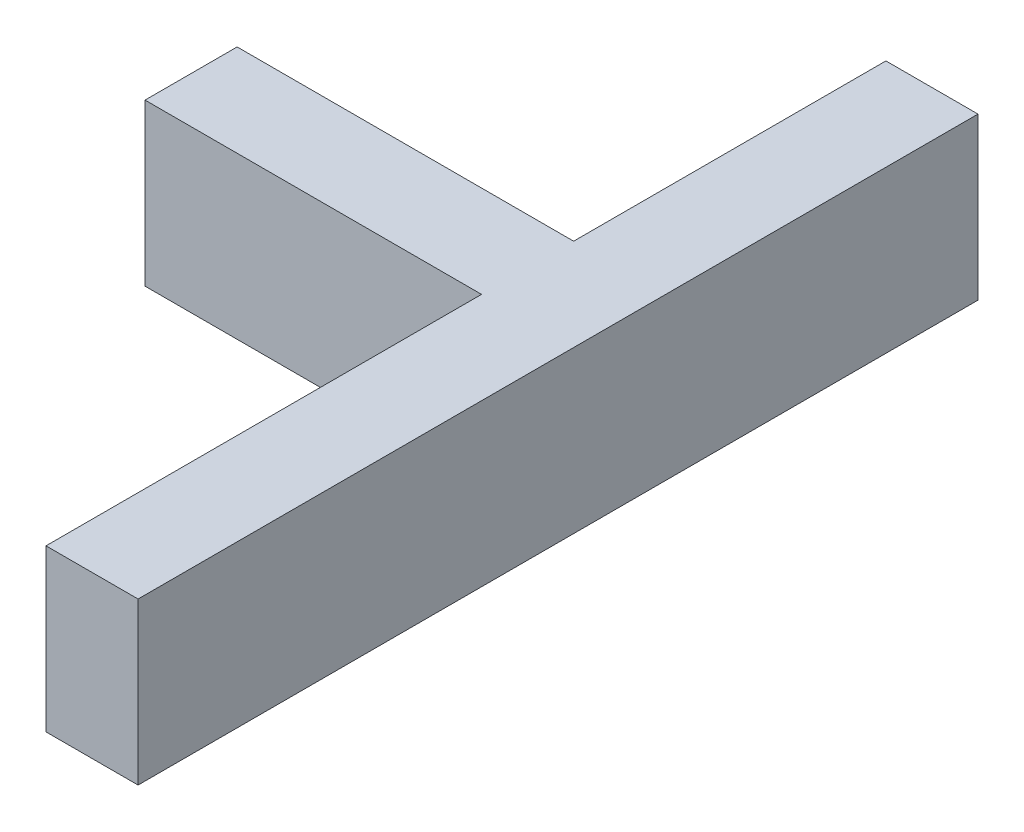
ISO-10303-21;
HEADER;
FILE_DESCRIPTION(('STEP AP214'),'2;1');
FILE_NAME('part.step','',(''),(''),'','','');
FILE_SCHEMA(('AUTOMOTIVE_DESIGN { 1 0 10303 214 1 1 1 1 }'));
ENDSEC;
DATA;
#1=APPLICATION_CONTEXT('core data for automotive mechanical design processes');
#2=APPLICATION_PROTOCOL_DEFINITION('international standard','automotive_design',2000,#1);
#3=PRODUCT_CONTEXT('',#1,'mechanical');
#4=PRODUCT('Part','Part','',(#3));
#5=PRODUCT_RELATED_PRODUCT_CATEGORY('part','',(#4));
#6=PRODUCT_DEFINITION_FORMATION('','',#4);
#7=PRODUCT_DEFINITION_CONTEXT('part definition',#1,'design');
#8=PRODUCT_DEFINITION('design','',#6,#7);
#9=PRODUCT_DEFINITION_SHAPE('','',#8);
#10=(LENGTH_UNIT() NAMED_UNIT(*) SI_UNIT(.MILLI.,.METRE.));
#11=(NAMED_UNIT(*) PLANE_ANGLE_UNIT() SI_UNIT($,.RADIAN.));
#12=(NAMED_UNIT(*) SI_UNIT($,.STERADIAN.) SOLID_ANGLE_UNIT());
#13=UNCERTAINTY_MEASURE_WITH_UNIT(LENGTH_MEASURE(1.E-05),#10,'distance_accuracy_value','');
#14=(GEOMETRIC_REPRESENTATION_CONTEXT(3) GLOBAL_UNCERTAINTY_ASSIGNED_CONTEXT((#13)) GLOBAL_UNIT_ASSIGNED_CONTEXT((#10,
#11,#12)) REPRESENTATION_CONTEXT('',''));
#15=CARTESIAN_POINT('',(0.,0.,0.));
#16=DIRECTION('',(0.,0.,1.));
#17=DIRECTION('',(1.,0.,0.));
#18=AXIS2_PLACEMENT_3D('',#15,#16,#17);
#19=CARTESIAN_POINT('',(0.,8.5,0.));
#20=DIRECTION('',(0.,-1.,0.));
#21=DIRECTION('',(0.,0.,-1.));
#22=AXIS2_PLACEMENT_3D('',#19,#20,#21);
#23=PLANE('',#22);
#24=DIRECTION('',(0.,0.,1.));
#25=VECTOR('',#24,1.);
#26=CARTESIAN_POINT('',(-99.51073581186,8.5,45.6758269376066));
#27=LINE('',#26,#25);
#28=CARTESIAN_POINT('',(-99.51073581186,8.5,32.1118689541155));
#29=VERTEX_POINT('',#28);
#30=CARTESIAN_POINT('',(-99.51073581186,8.5,45.6758269376066));
#31=VERTEX_POINT('',#30);
#32=EDGE_CURVE('E143',#29,#31,#27,.T.);
#33=ORIENTED_EDGE('',*,*,#32,.T.);
#34=DIRECTION('',(-1.,0.,0.));
#35=VECTOR('',#34,1.);
#36=CARTESIAN_POINT('',(-114.127069845794,8.5,45.6758269376066));
#37=LINE('',#36,#35);
#38=CARTESIAN_POINT('',(-114.127069845794,8.5,45.6758269376066));
#39=VERTEX_POINT('',#38);
#40=EDGE_CURVE('E119',#31,#39,#37,.T.);
#41=ORIENTED_EDGE('',*,*,#40,.T.);
#42=DIRECTION('',(0.,0.,1.));
#43=VECTOR('',#42,1.);
#44=CARTESIAN_POINT('',(-114.127069845794,8.5,49.6758269376066));
#45=LINE('',#44,#43);
#46=CARTESIAN_POINT('',(-114.127069845794,8.5,49.6758269376066));
#47=VERTEX_POINT('',#46);
#48=EDGE_CURVE('E163',#39,#47,#45,.T.);
#49=ORIENTED_EDGE('',*,*,#48,.T.);
#50=DIRECTION('',(1.,0.,0.));
#51=VECTOR('',#50,1.);
#52=CARTESIAN_POINT('',(-99.51073581186,8.5,49.6758269376066));
#53=LINE('',#52,#51);
#54=CARTESIAN_POINT('',(-99.51073581186,8.5,49.6758269376066));
#55=VERTEX_POINT('',#54);
#56=EDGE_CURVE('E165',#47,#55,#53,.T.);
#57=ORIENTED_EDGE('',*,*,#56,.T.);
#58=DIRECTION('',(0.,0.,1.));
#59=VECTOR('',#58,1.);
#60=CARTESIAN_POINT('',(-99.51073581186,8.5,68.5942387028157));
#61=LINE('',#60,#59);
#62=CARTESIAN_POINT('',(-99.51073581186,8.5,68.5942387028157));
#63=VERTEX_POINT('',#62);
#64=EDGE_CURVE('E167',#55,#63,#61,.T.);
#65=ORIENTED_EDGE('',*,*,#64,.T.);
#66=DIRECTION('',(1.,0.,0.));
#67=VECTOR('',#66,1.);
#68=CARTESIAN_POINT('',(-95.51073581186,8.5,68.5942387028157));
#69=LINE('',#68,#67);
#70=CARTESIAN_POINT('',(-95.51073581186,8.5,68.5942387028157));
#71=VERTEX_POINT('',#70);
#72=EDGE_CURVE('E173',#63,#71,#69,.T.);
#73=ORIENTED_EDGE('',*,*,#72,.T.);
#74=DIRECTION('',(0.,0.,-1.));
#75=VECTOR('',#74,1.);
#76=CARTESIAN_POINT('',(-95.51073581186,8.5,32.1118689541155));
#77=LINE('',#76,#75);
#78=CARTESIAN_POINT('',(-95.51073581186,8.5,32.1118689541155));
#79=VERTEX_POINT('',#78);
#80=EDGE_CURVE('E174',#71,#79,#77,.T.);
#81=ORIENTED_EDGE('',*,*,#80,.T.);
#82=DIRECTION('',(-1.,0.,0.));
#83=VECTOR('',#82,1.);
#84=CARTESIAN_POINT('',(-99.51073581186,8.5,32.1118689541155));
#85=LINE('',#84,#83);
#86=EDGE_CURVE('E61',#79,#29,#85,.T.);
#87=ORIENTED_EDGE('',*,*,#86,.T.);
#88=EDGE_LOOP('',(#33,#41,#49,#57,#65,#73,#81,#87));
#89=FACE_BOUND('',#88,.T.);
#90=ADVANCED_FACE('F45',(#89),#23,.F.);
#91=CARTESIAN_POINT('',(-114.127069845794,8.5,49.6758269376066));
#92=DIRECTION('',(1.,0.,0.));
#93=DIRECTION('',(0.,0.,-1.));
#94=AXIS2_PLACEMENT_3D('',#91,#92,#93);
#95=PLANE('',#94);
#96=DIRECTION('',(0.,0.,1.));
#97=VECTOR('',#96,1.);
#98=CARTESIAN_POINT('',(-114.127069845794,1.5,49.6758269376066));
#99=LINE('',#98,#97);
#100=CARTESIAN_POINT('',(-114.127069845794,1.5,45.6758269376066));
#101=VERTEX_POINT('',#100);
#102=CARTESIAN_POINT('',(-114.127069845794,1.5,49.6758269376066));
#103=VERTEX_POINT('',#102);
#104=EDGE_CURVE('E112',#101,#103,#99,.T.);
#105=ORIENTED_EDGE('',*,*,#104,.T.);
#106=DIRECTION('',(0.,-1.,0.));
#107=VECTOR('',#106,1.);
#108=CARTESIAN_POINT('',(-114.127069845794,8.5,49.6758269376066));
#109=LINE('',#108,#107);
#110=EDGE_CURVE('E157',#47,#103,#109,.T.);
#111=ORIENTED_EDGE('',*,*,#110,.F.);
#112=ORIENTED_EDGE('',*,*,#48,.F.);
#113=DIRECTION('',(0.,-1.,0.));
#114=VECTOR('',#113,1.);
#115=CARTESIAN_POINT('',(-114.127069845794,8.5,45.6758269376066));
#116=LINE('',#115,#114);
#117=EDGE_CURVE('E54',#39,#101,#116,.T.);
#118=ORIENTED_EDGE('',*,*,#117,.T.);
#119=EDGE_LOOP('',(#105,#111,#112,#118));
#120=FACE_BOUND('',#119,.T.);
#121=ADVANCED_FACE('F161',(#120),#95,.F.);
#122=CARTESIAN_POINT('',(-99.51073581186,8.5,49.6758269376066));
#123=DIRECTION('',(0.,0.,-1.));
#124=DIRECTION('',(-1.,0.,0.));
#125=AXIS2_PLACEMENT_3D('',#122,#123,#124);
#126=PLANE('',#125);
#127=DIRECTION('',(1.,0.,0.));
#128=VECTOR('',#127,1.);
#129=CARTESIAN_POINT('',(-99.51073581186,1.5,49.6758269376066));
#130=LINE('',#129,#128);
#131=CARTESIAN_POINT('',(-99.51073581186,1.5,49.6758269376066));
#132=VERTEX_POINT('',#131);
#133=EDGE_CURVE('E129',#103,#132,#130,.T.);
#134=ORIENTED_EDGE('',*,*,#133,.T.);
#135=DIRECTION('',(0.,-1.,0.));
#136=VECTOR('',#135,1.);
#137=CARTESIAN_POINT('',(-99.51073581186,8.5,49.6758269376066));
#138=LINE('',#137,#136);
#139=EDGE_CURVE('E154',#55,#132,#138,.T.);
#140=ORIENTED_EDGE('',*,*,#139,.F.);
#141=ORIENTED_EDGE('',*,*,#56,.F.);
#142=ORIENTED_EDGE('',*,*,#110,.T.);
#143=EDGE_LOOP('',(#134,#140,#141,#142));
#144=FACE_BOUND('',#143,.T.);
#145=ADVANCED_FACE('F191',(#144),#126,.F.);
#146=CARTESIAN_POINT('',(-99.51073581186,8.5,68.5942387028157));
#147=DIRECTION('',(1.,0.,0.));
#148=DIRECTION('',(0.,0.,-1.));
#149=AXIS2_PLACEMENT_3D('',#146,#147,#148);
#150=PLANE('',#149);
#151=DIRECTION('',(0.,0.,1.));
#152=VECTOR('',#151,1.);
#153=CARTESIAN_POINT('',(-99.51073581186,1.5,68.5942387028157));
#154=LINE('',#153,#152);
#155=CARTESIAN_POINT('',(-99.51073581186,1.5,68.5942387028157));
#156=VERTEX_POINT('',#155);
#157=EDGE_CURVE('E132',#132,#156,#154,.T.);
#158=ORIENTED_EDGE('',*,*,#157,.T.);
#159=DIRECTION('',(0.,-1.,0.));
#160=VECTOR('',#159,1.);
#161=CARTESIAN_POINT('',(-99.51073581186,8.5,68.5942387028157));
#162=LINE('',#161,#160);
#163=EDGE_CURVE('E151',#63,#156,#162,.T.);
#164=ORIENTED_EDGE('',*,*,#163,.F.);
#165=ORIENTED_EDGE('',*,*,#64,.F.);
#166=ORIENTED_EDGE('',*,*,#139,.T.);
#167=EDGE_LOOP('',(#158,#164,#165,#166));
#168=FACE_BOUND('',#167,.T.);
#169=ADVANCED_FACE('F188',(#168),#150,.F.);
#170=CARTESIAN_POINT('',(-95.51073581186,8.5,68.5942387028157));
#171=DIRECTION('',(0.,0.,-1.));
#172=DIRECTION('',(-1.,0.,0.));
#173=AXIS2_PLACEMENT_3D('',#170,#171,#172);
#174=PLANE('',#173);
#175=DIRECTION('',(1.,0.,0.));
#176=VECTOR('',#175,1.);
#177=CARTESIAN_POINT('',(-95.51073581186,1.5,68.5942387028157));
#178=LINE('',#177,#176);
#179=CARTESIAN_POINT('',(-95.51073581186,1.5,68.5942387028157));
#180=VERTEX_POINT('',#179);
#181=EDGE_CURVE('E135',#156,#180,#178,.T.);
#182=ORIENTED_EDGE('',*,*,#181,.T.);
#183=DIRECTION('',(0.,-1.,0.));
#184=VECTOR('',#183,1.);
#185=CARTESIAN_POINT('',(-95.51073581186,8.5,68.5942387028157));
#186=LINE('',#185,#184);
#187=EDGE_CURVE('E148',#71,#180,#186,.T.);
#188=ORIENTED_EDGE('',*,*,#187,.F.);
#189=ORIENTED_EDGE('',*,*,#72,.F.);
#190=ORIENTED_EDGE('',*,*,#163,.T.);
#191=EDGE_LOOP('',(#182,#188,#189,#190));
#192=FACE_BOUND('',#191,.T.);
#193=ADVANCED_FACE('F184',(#192),#174,.F.);
#194=CARTESIAN_POINT('',(-95.51073581186,8.5,32.1118689541155));
#195=DIRECTION('',(-1.,0.,0.));
#196=DIRECTION('',(0.,0.,1.));
#197=AXIS2_PLACEMENT_3D('',#194,#195,#196);
#198=PLANE('',#197);
#199=DIRECTION('',(0.,0.,-1.));
#200=VECTOR('',#199,1.);
#201=CARTESIAN_POINT('',(-95.51073581186,1.5,32.1118689541155));
#202=LINE('',#201,#200);
#203=CARTESIAN_POINT('',(-95.51073581186,1.5,32.1118689541155));
#204=VERTEX_POINT('',#203);
#205=EDGE_CURVE('E138',#180,#204,#202,.T.);
#206=ORIENTED_EDGE('',*,*,#205,.T.);
#207=DIRECTION('',(0.,-1.,0.));
#208=VECTOR('',#207,1.);
#209=CARTESIAN_POINT('',(-95.51073581186,8.5,32.1118689541155));
#210=LINE('',#209,#208);
#211=EDGE_CURVE('E145',#79,#204,#210,.T.);
#212=ORIENTED_EDGE('',*,*,#211,.F.);
#213=ORIENTED_EDGE('',*,*,#80,.F.);
#214=ORIENTED_EDGE('',*,*,#187,.T.);
#215=EDGE_LOOP('',(#206,#212,#213,#214));
#216=FACE_BOUND('',#215,.T.);
#217=ADVANCED_FACE('F180',(#216),#198,.F.);
#218=CARTESIAN_POINT('',(-99.51073581186,8.5,32.1118689541155));
#219=DIRECTION('',(0.,0.,1.));
#220=DIRECTION('',(1.,0.,0.));
#221=AXIS2_PLACEMENT_3D('',#218,#219,#220);
#222=PLANE('',#221);
#223=DIRECTION('',(-1.,0.,0.));
#224=VECTOR('',#223,1.);
#225=CARTESIAN_POINT('',(-99.51073581186,1.5,32.1118689541155));
#226=LINE('',#225,#224);
#227=CARTESIAN_POINT('',(-99.51073581186,1.5,32.1118689541155));
#228=VERTEX_POINT('',#227);
#229=EDGE_CURVE('E141',#204,#228,#226,.T.);
#230=ORIENTED_EDGE('',*,*,#229,.T.);
#231=DIRECTION('',(0.,-1.,0.));
#232=VECTOR('',#231,1.);
#233=CARTESIAN_POINT('',(-99.51073581186,8.5,32.1118689541155));
#234=LINE('',#233,#232);
#235=EDGE_CURVE('E123',#29,#228,#234,.T.);
#236=ORIENTED_EDGE('',*,*,#235,.F.);
#237=ORIENTED_EDGE('',*,*,#86,.F.);
#238=ORIENTED_EDGE('',*,*,#211,.T.);
#239=EDGE_LOOP('',(#230,#236,#237,#238));
#240=FACE_BOUND('',#239,.T.);
#241=ADVANCED_FACE('F182',(#240),#222,.F.);
#242=CARTESIAN_POINT('',(-99.51073581186,8.5,45.6758269376066));
#243=DIRECTION('',(1.,0.,0.));
#244=DIRECTION('',(0.,0.,-1.));
#245=AXIS2_PLACEMENT_3D('',#242,#243,#244);
#246=PLANE('',#245);
#247=DIRECTION('',(0.,0.,1.));
#248=VECTOR('',#247,1.);
#249=CARTESIAN_POINT('',(-99.51073581186,1.5,45.6758269376066));
#250=LINE('',#249,#248);
#251=CARTESIAN_POINT('',(-99.51073581186,1.5,45.6758269376066));
#252=VERTEX_POINT('',#251);
#253=EDGE_CURVE('E109',#228,#252,#250,.T.);
#254=ORIENTED_EDGE('',*,*,#253,.T.);
#255=DIRECTION('',(0.,-1.,0.));
#256=VECTOR('',#255,1.);
#257=CARTESIAN_POINT('',(-99.51073581186,8.5,45.6758269376066));
#258=LINE('',#257,#256);
#259=EDGE_CURVE('E11',#31,#252,#258,.T.);
#260=ORIENTED_EDGE('',*,*,#259,.F.);
#261=ORIENTED_EDGE('',*,*,#32,.F.);
#262=ORIENTED_EDGE('',*,*,#235,.T.);
#263=EDGE_LOOP('',(#254,#260,#261,#262));
#264=FACE_BOUND('',#263,.T.);
#265=ADVANCED_FACE('F47',(#264),#246,.F.);
#266=CARTESIAN_POINT('',(-114.127069845794,8.5,45.6758269376066));
#267=DIRECTION('',(0.,0.,1.));
#268=DIRECTION('',(1.,0.,0.));
#269=AXIS2_PLACEMENT_3D('',#266,#267,#268);
#270=PLANE('',#269);
#271=DIRECTION('',(-1.,0.,0.));
#272=VECTOR('',#271,1.);
#273=CARTESIAN_POINT('',(-114.127069845794,1.5,45.6758269376066));
#274=LINE('',#273,#272);
#275=EDGE_CURVE('E106',#252,#101,#274,.T.);
#276=ORIENTED_EDGE('',*,*,#275,.T.);
#277=ORIENTED_EDGE('',*,*,#117,.F.);
#278=ORIENTED_EDGE('',*,*,#40,.F.);
#279=ORIENTED_EDGE('',*,*,#259,.T.);
#280=EDGE_LOOP('',(#276,#277,#278,#279));
#281=FACE_BOUND('',#280,.T.);
#282=ADVANCED_FACE('F118',(#281),#270,.F.);
#283=CARTESIAN_POINT('',(-117.451544006878,1.5,71.2010751712449));
#284=DIRECTION('',(0.,1.,0.));
#285=DIRECTION('',(0.,0.,1.));
#286=AXIS2_PLACEMENT_3D('',#283,#284,#285);
#287=PLANE('',#286);
#288=ORIENTED_EDGE('',*,*,#275,.F.);
#289=ORIENTED_EDGE('',*,*,#253,.F.);
#290=ORIENTED_EDGE('',*,*,#229,.F.);
#291=ORIENTED_EDGE('',*,*,#205,.F.);
#292=ORIENTED_EDGE('',*,*,#181,.F.);
#293=ORIENTED_EDGE('',*,*,#157,.F.);
#294=ORIENTED_EDGE('',*,*,#133,.F.);
#295=ORIENTED_EDGE('',*,*,#104,.F.);
#296=EDGE_LOOP('',(#288,#289,#290,#291,#292,#293,#294,#295));
#297=FACE_BOUND('',#296,.T.);
#298=ADVANCED_FACE('F107',(#297),#287,.F.);
#299=CLOSED_SHELL('',(#90,#121,#145,#169,#193,#217,#241,#265,#282,#298));
#300=MANIFOLD_SOLID_BREP('B2',#299);
#301=ADVANCED_BREP_SHAPE_REPRESENTATION('',(#18,#300),#14);
#302=SHAPE_DEFINITION_REPRESENTATION(#9,#301);
ENDSEC;
END-ISO-10303-21;
